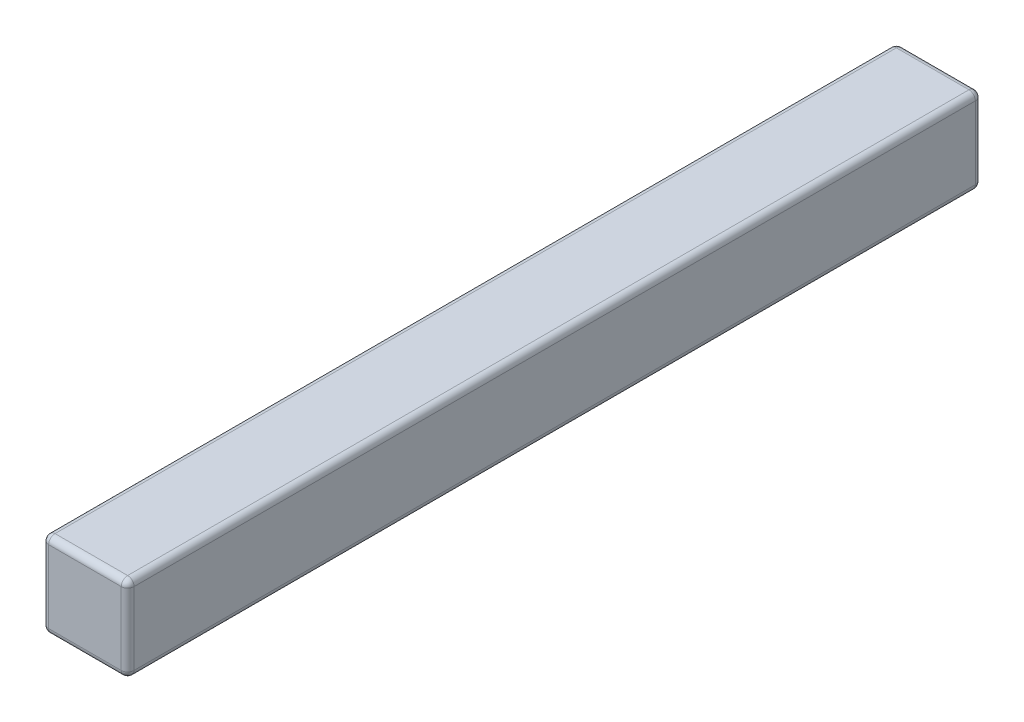
ISO-10303-21;
HEADER;
FILE_DESCRIPTION(('STEP AP214'),'2;1');
FILE_NAME('part.step','',(''),(''),'','','');
FILE_SCHEMA(('AUTOMOTIVE_DESIGN { 1 0 10303 214 1 1 1 1 }'));
ENDSEC;
DATA;
#1=APPLICATION_CONTEXT('core data for automotive mechanical design processes');
#2=APPLICATION_PROTOCOL_DEFINITION('international standard','automotive_design',2000,#1);
#3=PRODUCT_CONTEXT('',#1,'mechanical');
#4=PRODUCT('Part','Part','',(#3));
#5=PRODUCT_RELATED_PRODUCT_CATEGORY('part','',(#4));
#6=PRODUCT_DEFINITION_FORMATION('','',#4);
#7=PRODUCT_DEFINITION_CONTEXT('part definition',#1,'design');
#8=PRODUCT_DEFINITION('design','',#6,#7);
#9=PRODUCT_DEFINITION_SHAPE('','',#8);
#10=(LENGTH_UNIT() NAMED_UNIT(*) SI_UNIT(.MILLI.,.METRE.));
#11=(NAMED_UNIT(*) PLANE_ANGLE_UNIT() SI_UNIT($,.RADIAN.));
#12=(NAMED_UNIT(*) SI_UNIT($,.STERADIAN.) SOLID_ANGLE_UNIT());
#13=UNCERTAINTY_MEASURE_WITH_UNIT(LENGTH_MEASURE(1.E-05),#10,'distance_accuracy_value','');
#14=(GEOMETRIC_REPRESENTATION_CONTEXT(3) GLOBAL_UNCERTAINTY_ASSIGNED_CONTEXT((#13)) GLOBAL_UNIT_ASSIGNED_CONTEXT((#10,
#11,#12)) REPRESENTATION_CONTEXT('',''));
#15=CARTESIAN_POINT('',(0.,0.,0.));
#16=DIRECTION('',(0.,0.,1.));
#17=DIRECTION('',(1.,0.,0.));
#18=AXIS2_PLACEMENT_3D('',#15,#16,#17);
#19=CARTESIAN_POINT('',(1.,-1.,10.));
#20=DIRECTION('',(0.,1.,0.));
#21=DIRECTION('',(-1.,0.,0.));
#22=AXIS2_PLACEMENT_3D('',#19,#20,#21);
#23=PLANE('',#22);
#24=DIRECTION('',(1.,0.,0.));
#25=VECTOR('',#24,1.);
#26=CARTESIAN_POINT('',(1.,-1.,9.85));
#27=LINE('',#26,#25);
#28=CARTESIAN_POINT('',(0.85,-1.,9.85));
#29=VERTEX_POINT('',#28);
#30=CARTESIAN_POINT('',(-0.85,-1.,9.85));
#31=VERTEX_POINT('',#30);
#32=EDGE_CURVE('E131',#29,#31,#27,.F.);
#33=ORIENTED_EDGE('',*,*,#32,.T.);
#34=DIRECTION('',(0.,0.,-1.));
#35=VECTOR('',#34,1.);
#36=CARTESIAN_POINT('',(-0.85,-1.,10.));
#37=LINE('',#36,#35);
#38=CARTESIAN_POINT('',(-0.85,-1.,-9.85));
#39=VERTEX_POINT('',#38);
#40=EDGE_CURVE('E167',#31,#39,#37,.T.);
#41=ORIENTED_EDGE('',*,*,#40,.T.);
#42=DIRECTION('',(1.,0.,0.));
#43=VECTOR('',#42,1.);
#44=CARTESIAN_POINT('',(1.,-1.,-9.85));
#45=LINE('',#44,#43);
#46=CARTESIAN_POINT('',(0.85,-1.,-9.85));
#47=VERTEX_POINT('',#46);
#48=EDGE_CURVE('E134',#39,#47,#45,.T.);
#49=ORIENTED_EDGE('',*,*,#48,.T.);
#50=DIRECTION('',(0.,0.,-1.));
#51=VECTOR('',#50,1.);
#52=CARTESIAN_POINT('',(0.85,-1.,10.));
#53=LINE('',#52,#51);
#54=EDGE_CURVE('E127',#47,#29,#53,.F.);
#55=ORIENTED_EDGE('',*,*,#54,.T.);
#56=EDGE_LOOP('',(#33,#41,#49,#55));
#57=FACE_BOUND('',#56,.T.);
#58=ADVANCED_FACE('F39',(#57),#23,.F.);
#59=CARTESIAN_POINT('',(1.,-1.,10.));
#60=DIRECTION('',(-1.,0.,0.));
#61=DIRECTION('',(0.,0.,1.));
#62=AXIS2_PLACEMENT_3D('',#59,#60,#61);
#63=PLANE('',#62);
#64=DIRECTION('',(0.,1.,0.));
#65=VECTOR('',#64,1.);
#66=CARTESIAN_POINT('',(1.,1.,-9.85));
#67=LINE('',#66,#65);
#68=CARTESIAN_POINT('',(1.,-0.85,-9.85));
#69=VERTEX_POINT('',#68);
#70=CARTESIAN_POINT('',(1.,0.850000000000001,-9.85));
#71=VERTEX_POINT('',#70);
#72=EDGE_CURVE('E199',#69,#71,#67,.T.);
#73=ORIENTED_EDGE('',*,*,#72,.T.);
#74=DIRECTION('',(0.,0.,-1.));
#75=VECTOR('',#74,1.);
#76=CARTESIAN_POINT('',(1.,0.850000000000001,10.));
#77=LINE('',#76,#75);
#78=CARTESIAN_POINT('',(1.,0.850000000000001,9.85));
#79=VERTEX_POINT('',#78);
#80=EDGE_CURVE('E201',#71,#79,#77,.F.);
#81=ORIENTED_EDGE('',*,*,#80,.T.);
#82=DIRECTION('',(0.,1.,0.));
#83=VECTOR('',#82,1.);
#84=CARTESIAN_POINT('',(1.,-1.,9.85));
#85=LINE('',#84,#83);
#86=CARTESIAN_POINT('',(1.,-0.85,9.85));
#87=VERTEX_POINT('',#86);
#88=EDGE_CURVE('E196',#79,#87,#85,.F.);
#89=ORIENTED_EDGE('',*,*,#88,.T.);
#90=DIRECTION('',(0.,0.,-1.));
#91=VECTOR('',#90,1.);
#92=CARTESIAN_POINT('',(1.,-0.85,10.));
#93=LINE('',#92,#91);
#94=EDGE_CURVE('E144',#87,#69,#93,.T.);
#95=ORIENTED_EDGE('',*,*,#94,.T.);
#96=EDGE_LOOP('',(#73,#81,#89,#95));
#97=FACE_BOUND('',#96,.T.);
#98=ADVANCED_FACE('F300',(#97),#63,.F.);
#99=CARTESIAN_POINT('',(1.,1.,10.));
#100=DIRECTION('',(0.,-1.,0.));
#101=DIRECTION('',(1.,0.,0.));
#102=AXIS2_PLACEMENT_3D('',#99,#100,#101);
#103=PLANE('',#102);
#104=DIRECTION('',(-1.,0.,0.));
#105=VECTOR('',#104,1.);
#106=CARTESIAN_POINT('',(-1.,1.,-9.85));
#107=LINE('',#106,#105);
#108=CARTESIAN_POINT('',(0.85,1.,-9.85));
#109=VERTEX_POINT('',#108);
#110=CARTESIAN_POINT('',(-0.850000000000001,1.,-9.85));
#111=VERTEX_POINT('',#110);
#112=EDGE_CURVE('E191',#109,#111,#107,.T.);
#113=ORIENTED_EDGE('',*,*,#112,.T.);
#114=DIRECTION('',(0.,0.,-1.));
#115=VECTOR('',#114,1.);
#116=CARTESIAN_POINT('',(-0.850000000000001,1.,10.));
#117=LINE('',#116,#115);
#118=CARTESIAN_POINT('',(-0.850000000000001,1.,9.85));
#119=VERTEX_POINT('',#118);
#120=EDGE_CURVE('E193',#111,#119,#117,.F.);
#121=ORIENTED_EDGE('',*,*,#120,.T.);
#122=DIRECTION('',(-1.,0.,0.));
#123=VECTOR('',#122,1.);
#124=CARTESIAN_POINT('',(1.,1.,9.85));
#125=LINE('',#124,#123);
#126=CARTESIAN_POINT('',(0.85,1.,9.85));
#127=VERTEX_POINT('',#126);
#128=EDGE_CURVE('E187',#119,#127,#125,.F.);
#129=ORIENTED_EDGE('',*,*,#128,.T.);
#130=DIRECTION('',(0.,0.,-1.));
#131=VECTOR('',#130,1.);
#132=CARTESIAN_POINT('',(0.85,1.,10.));
#133=LINE('',#132,#131);
#134=EDGE_CURVE('E189',#127,#109,#133,.T.);
#135=ORIENTED_EDGE('',*,*,#134,.T.);
#136=EDGE_LOOP('',(#113,#121,#129,#135));
#137=FACE_BOUND('',#136,.T.);
#138=ADVANCED_FACE('F280',(#137),#103,.F.);
#139=CARTESIAN_POINT('',(-1.,-1.,10.));
#140=DIRECTION('',(1.,0.,0.));
#141=DIRECTION('',(0.,1.,0.));
#142=AXIS2_PLACEMENT_3D('',#139,#140,#141);
#143=PLANE('',#142);
#144=DIRECTION('',(0.,-1.,0.));
#145=VECTOR('',#144,1.);
#146=CARTESIAN_POINT('',(-1.,-1.,-9.85));
#147=LINE('',#146,#145);
#148=CARTESIAN_POINT('',(-1.,0.85,-9.85));
#149=VERTEX_POINT('',#148);
#150=CARTESIAN_POINT('',(-1.,-0.85,-9.85));
#151=VERTEX_POINT('',#150);
#152=EDGE_CURVE('E173',#149,#151,#147,.T.);
#153=ORIENTED_EDGE('',*,*,#152,.T.);
#154=DIRECTION('',(0.,0.,-1.));
#155=VECTOR('',#154,1.);
#156=CARTESIAN_POINT('',(-1.,-0.85,10.));
#157=LINE('',#156,#155);
#158=CARTESIAN_POINT('',(-1.,-0.85,9.85));
#159=VERTEX_POINT('',#158);
#160=EDGE_CURVE('E175',#151,#159,#157,.F.);
#161=ORIENTED_EDGE('',*,*,#160,.T.);
#162=DIRECTION('',(0.,-1.,0.));
#163=VECTOR('',#162,1.);
#164=CARTESIAN_POINT('',(-1.,-1.,9.85));
#165=LINE('',#164,#163);
#166=CARTESIAN_POINT('',(-1.,0.85,9.85));
#167=VERTEX_POINT('',#166);
#168=EDGE_CURVE('E169',#159,#167,#165,.F.);
#169=ORIENTED_EDGE('',*,*,#168,.T.);
#170=DIRECTION('',(0.,0.,-1.));
#171=VECTOR('',#170,1.);
#172=CARTESIAN_POINT('',(-1.,0.85,10.));
#173=LINE('',#172,#171);
#174=EDGE_CURVE('E171',#167,#149,#173,.T.);
#175=ORIENTED_EDGE('',*,*,#174,.T.);
#176=EDGE_LOOP('',(#153,#161,#169,#175));
#177=FACE_BOUND('',#176,.T.);
#178=ADVANCED_FACE('F307',(#177),#143,.F.);
#179=CARTESIAN_POINT('',(0.,0.,10.));
#180=DIRECTION('',(0.,0.,-1.));
#181=DIRECTION('',(-1.,0.,0.));
#182=AXIS2_PLACEMENT_3D('',#179,#180,#181);
#183=PLANE('',#182);
#184=DIRECTION('',(-1.,0.,0.));
#185=VECTOR('',#184,1.);
#186=CARTESIAN_POINT('',(0.,0.85,10.));
#187=LINE('',#186,#185);
#188=CARTESIAN_POINT('',(0.85,0.850000000000001,10.));
#189=VERTEX_POINT('',#188);
#190=CARTESIAN_POINT('',(-0.850000000000001,0.85,10.));
#191=VERTEX_POINT('',#190);
#192=EDGE_CURVE('E48',#189,#191,#187,.T.);
#193=ORIENTED_EDGE('',*,*,#192,.T.);
#194=DIRECTION('',(0.,-1.,0.));
#195=VECTOR('',#194,1.);
#196=CARTESIAN_POINT('',(-0.850000000000001,0.,10.));
#197=LINE('',#196,#195);
#198=CARTESIAN_POINT('',(-0.850000000000001,-0.85,10.));
#199=VERTEX_POINT('',#198);
#200=EDGE_CURVE('E11',#191,#199,#197,.T.);
#201=ORIENTED_EDGE('',*,*,#200,.T.);
#202=DIRECTION('',(1.,0.,0.));
#203=VECTOR('',#202,1.);
#204=CARTESIAN_POINT('',(0.,-0.85,10.));
#205=LINE('',#204,#203);
#206=CARTESIAN_POINT('',(0.85,-0.85,10.));
#207=VERTEX_POINT('',#206);
#208=EDGE_CURVE('E204',#199,#207,#205,.T.);
#209=ORIENTED_EDGE('',*,*,#208,.T.);
#210=DIRECTION('',(0.,1.,0.));
#211=VECTOR('',#210,1.);
#212=CARTESIAN_POINT('',(0.85,0.,10.));
#213=LINE('',#212,#211);
#214=EDGE_CURVE('E59',#207,#189,#213,.T.);
#215=ORIENTED_EDGE('',*,*,#214,.T.);
#216=EDGE_LOOP('',(#193,#201,#209,#215));
#217=FACE_BOUND('',#216,.T.);
#218=ADVANCED_FACE('F371',(#217),#183,.F.);
#219=CARTESIAN_POINT('',(0.,0.,-10.));
#220=DIRECTION('',(0.,0.,-1.));
#221=DIRECTION('',(-1.,0.,0.));
#222=AXIS2_PLACEMENT_3D('',#219,#220,#221);
#223=PLANE('',#222);
#224=DIRECTION('',(1.,0.,0.));
#225=VECTOR('',#224,1.);
#226=CARTESIAN_POINT('',(-1.,-0.850000000000001,-10.));
#227=LINE('',#226,#225);
#228=CARTESIAN_POINT('',(0.85,-0.85,-10.));
#229=VERTEX_POINT('',#228);
#230=CARTESIAN_POINT('',(-0.850000000000001,-0.85,-10.));
#231=VERTEX_POINT('',#230);
#232=EDGE_CURVE('E182',#229,#231,#227,.F.);
#233=ORIENTED_EDGE('',*,*,#232,.T.);
#234=DIRECTION('',(0.,-1.,0.));
#235=VECTOR('',#234,1.);
#236=CARTESIAN_POINT('',(-0.850000000000001,1.,-10.));
#237=LINE('',#236,#235);
#238=CARTESIAN_POINT('',(-0.850000000000001,0.85,-10.));
#239=VERTEX_POINT('',#238);
#240=EDGE_CURVE('E184',#231,#239,#237,.F.);
#241=ORIENTED_EDGE('',*,*,#240,.T.);
#242=DIRECTION('',(-1.,0.,0.));
#243=VECTOR('',#242,1.);
#244=CARTESIAN_POINT('',(1.,0.850000000000001,-10.));
#245=LINE('',#244,#243);
#246=CARTESIAN_POINT('',(0.85,0.850000000000001,-10.));
#247=VERTEX_POINT('',#246);
#248=EDGE_CURVE('E180',#239,#247,#245,.F.);
#249=ORIENTED_EDGE('',*,*,#248,.T.);
#250=DIRECTION('',(0.,1.,0.));
#251=VECTOR('',#250,1.);
#252=CARTESIAN_POINT('',(0.85,-1.,-10.));
#253=LINE('',#252,#251);
#254=EDGE_CURVE('E178',#247,#229,#253,.F.);
#255=ORIENTED_EDGE('',*,*,#254,.T.);
#256=EDGE_LOOP('',(#233,#241,#249,#255));
#257=FACE_BOUND('',#256,.T.);
#258=ADVANCED_FACE('F271',(#257),#223,.T.);
#259=CARTESIAN_POINT('',(0.85,0.850000000000001,10.));
#260=DIRECTION('',(0.,0.,-1.));
#261=DIRECTION('',(-1.,0.,0.));
#262=AXIS2_PLACEMENT_3D('',#259,#260,#261);
#263=CYLINDRICAL_SURFACE('',#262,0.15);
#264=CARTESIAN_POINT('',(0.85,0.850000000000001,9.85));
#265=DIRECTION('',(0.,0.,1.));
#266=DIRECTION('',(1.,0.,0.));
#267=AXIS2_PLACEMENT_3D('',#264,#265,#266);
#268=CIRCLE('',#267,0.15);
#269=EDGE_CURVE('E43',#79,#127,#268,.T.);
#270=ORIENTED_EDGE('',*,*,#269,.F.);
#271=ORIENTED_EDGE('',*,*,#80,.F.);
#272=CARTESIAN_POINT('',(0.85,0.850000000000001,-9.85));
#273=DIRECTION('',(0.,0.,-1.));
#274=DIRECTION('',(-1.,0.,0.));
#275=AXIS2_PLACEMENT_3D('',#272,#273,#274);
#276=CIRCLE('',#275,0.15);
#277=EDGE_CURVE('E164',#109,#71,#276,.T.);
#278=ORIENTED_EDGE('',*,*,#277,.F.);
#279=ORIENTED_EDGE('',*,*,#134,.F.);
#280=EDGE_LOOP('',(#270,#271,#278,#279));
#281=FACE_BOUND('',#280,.T.);
#282=ADVANCED_FACE('F41',(#281),#263,.T.);
#283=CARTESIAN_POINT('',(0.85,0.850000000000001,9.85));
#284=DIRECTION('',(0.,0.,1.));
#285=DIRECTION('',(1.,0.,0.));
#286=AXIS2_PLACEMENT_3D('',#283,#284,#285);
#287=SPHERICAL_SURFACE('',#286,0.15);
#288=CARTESIAN_POINT('',(0.85,0.850000000000001,9.85));
#289=DIRECTION('',(0.,1.,0.));
#290=DIRECTION('',(0.,0.,1.));
#291=AXIS2_PLACEMENT_3D('',#288,#289,#290);
#292=CIRCLE('',#291,0.15);
#293=EDGE_CURVE('E250',#79,#189,#292,.F.);
#294=ORIENTED_EDGE('',*,*,#293,.F.);
#295=ORIENTED_EDGE('',*,*,#269,.T.);
#296=CARTESIAN_POINT('',(0.85,0.850000000000001,9.85));
#297=DIRECTION('',(1.,0.,0.));
#298=DIRECTION('',(0.,0.,-1.));
#299=AXIS2_PLACEMENT_3D('',#296,#297,#298);
#300=CIRCLE('',#299,0.15);
#301=EDGE_CURVE('E252',#189,#127,#300,.F.);
#302=ORIENTED_EDGE('',*,*,#301,.F.);
#303=EDGE_LOOP('',(#294,#295,#302));
#304=FACE_BOUND('',#303,.T.);
#305=ADVANCED_FACE('F296',(#304),#287,.T.);
#306=CARTESIAN_POINT('',(0.85,0.850000000000001,-9.85));
#307=DIRECTION('',(0.,0.,1.));
#308=DIRECTION('',(1.,0.,0.));
#309=AXIS2_PLACEMENT_3D('',#306,#307,#308);
#310=SPHERICAL_SURFACE('',#309,0.15);
#311=CARTESIAN_POINT('',(0.85,0.850000000000001,-9.85));
#312=DIRECTION('',(1.,0.,0.));
#313=DIRECTION('',(0.,0.,-1.));
#314=AXIS2_PLACEMENT_3D('',#311,#312,#313);
#315=CIRCLE('',#314,0.15);
#316=EDGE_CURVE('E244',#109,#247,#315,.F.);
#317=ORIENTED_EDGE('',*,*,#316,.F.);
#318=ORIENTED_EDGE('',*,*,#277,.T.);
#319=CARTESIAN_POINT('',(0.85,0.850000000000001,-9.85));
#320=DIRECTION('',(0.,1.,0.));
#321=DIRECTION('',(0.,0.,1.));
#322=AXIS2_PLACEMENT_3D('',#319,#320,#321);
#323=CIRCLE('',#322,0.15);
#324=EDGE_CURVE('E247',#247,#71,#323,.F.);
#325=ORIENTED_EDGE('',*,*,#324,.F.);
#326=EDGE_LOOP('',(#317,#318,#325));
#327=FACE_BOUND('',#326,.T.);
#328=ADVANCED_FACE('F259',(#327),#310,.T.);
#329=CARTESIAN_POINT('',(0.,0.85,9.85));
#330=DIRECTION('',(-1.,0.,0.));
#331=DIRECTION('',(0.,-1.,0.));
#332=AXIS2_PLACEMENT_3D('',#329,#330,#331);
#333=CYLINDRICAL_SURFACE('',#332,0.15);
#334=ORIENTED_EDGE('',*,*,#301,.T.);
#335=ORIENTED_EDGE('',*,*,#128,.F.);
#336=CARTESIAN_POINT('',(-0.850000000000001,0.85,9.85));
#337=DIRECTION('',(-1.,0.,0.));
#338=DIRECTION('',(0.,0.,1.));
#339=AXIS2_PLACEMENT_3D('',#336,#337,#338);
#340=CIRCLE('',#339,0.15);
#341=EDGE_CURVE('E239',#191,#119,#340,.T.);
#342=ORIENTED_EDGE('',*,*,#341,.F.);
#343=ORIENTED_EDGE('',*,*,#192,.F.);
#344=EDGE_LOOP('',(#334,#335,#342,#343));
#345=FACE_BOUND('',#344,.T.);
#346=ADVANCED_FACE('F291',(#345),#333,.T.);
#347=CARTESIAN_POINT('',(0.85,0.,9.85));
#348=DIRECTION('',(0.,1.,0.));
#349=DIRECTION('',(0.,0.,1.));
#350=AXIS2_PLACEMENT_3D('',#347,#348,#349);
#351=CYLINDRICAL_SURFACE('',#350,0.15);
#352=ORIENTED_EDGE('',*,*,#293,.T.);
#353=ORIENTED_EDGE('',*,*,#214,.F.);
#354=CARTESIAN_POINT('',(0.85,-0.85,9.85));
#355=DIRECTION('',(0.,-1.,0.));
#356=DIRECTION('',(0.,0.,-1.));
#357=AXIS2_PLACEMENT_3D('',#354,#355,#356);
#358=CIRCLE('',#357,0.15);
#359=EDGE_CURVE('E148',#87,#207,#358,.T.);
#360=ORIENTED_EDGE('',*,*,#359,.F.);
#361=ORIENTED_EDGE('',*,*,#88,.F.);
#362=EDGE_LOOP('',(#352,#353,#360,#361));
#363=FACE_BOUND('',#362,.T.);
#364=ADVANCED_FACE('F298',(#363),#351,.T.);
#365=CARTESIAN_POINT('',(0.85,-0.85,10.));
#366=DIRECTION('',(0.,0.,-1.));
#367=DIRECTION('',(-1.,0.,0.));
#368=AXIS2_PLACEMENT_3D('',#365,#366,#367);
#369=CYLINDRICAL_SURFACE('',#368,0.15);
#370=CARTESIAN_POINT('',(0.85,-0.85,-9.85));
#371=DIRECTION('',(0.,0.,-1.));
#372=DIRECTION('',(-1.,0.,0.));
#373=AXIS2_PLACEMENT_3D('',#370,#371,#372);
#374=CIRCLE('',#373,0.15);
#375=EDGE_CURVE('E149',#69,#47,#374,.T.);
#376=ORIENTED_EDGE('',*,*,#375,.F.);
#377=ORIENTED_EDGE('',*,*,#94,.F.);
#378=CARTESIAN_POINT('',(0.85,-0.85,9.85));
#379=DIRECTION('',(0.,0.,1.));
#380=DIRECTION('',(1.,0.,0.));
#381=AXIS2_PLACEMENT_3D('',#378,#379,#380);
#382=CIRCLE('',#381,0.15);
#383=EDGE_CURVE('E141',#29,#87,#382,.T.);
#384=ORIENTED_EDGE('',*,*,#383,.F.);
#385=ORIENTED_EDGE('',*,*,#54,.F.);
#386=EDGE_LOOP('',(#376,#377,#384,#385));
#387=FACE_BOUND('',#386,.T.);
#388=ADVANCED_FACE('F143',(#387),#369,.T.);
#389=CARTESIAN_POINT('',(0.85,-1.,-9.85));
#390=DIRECTION('',(0.,-1.,0.));
#391=DIRECTION('',(0.,0.,-1.));
#392=AXIS2_PLACEMENT_3D('',#389,#390,#391);
#393=CYLINDRICAL_SURFACE('',#392,0.15);
#394=ORIENTED_EDGE('',*,*,#324,.T.);
#395=ORIENTED_EDGE('',*,*,#72,.F.);
#396=CARTESIAN_POINT('',(0.85,-0.85,-9.85));
#397=DIRECTION('',(0.,-1.,0.));
#398=DIRECTION('',(1.,0.,0.));
#399=AXIS2_PLACEMENT_3D('',#396,#397,#398);
#400=CIRCLE('',#399,0.15);
#401=EDGE_CURVE('E234',#229,#69,#400,.T.);
#402=ORIENTED_EDGE('',*,*,#401,.F.);
#403=ORIENTED_EDGE('',*,*,#254,.F.);
#404=EDGE_LOOP('',(#394,#395,#402,#403));
#405=FACE_BOUND('',#404,.T.);
#406=ADVANCED_FACE('F267',(#405),#393,.T.);
#407=CARTESIAN_POINT('',(1.,0.850000000000001,-9.85));
#408=DIRECTION('',(1.,0.,0.));
#409=DIRECTION('',(0.,1.,0.));
#410=AXIS2_PLACEMENT_3D('',#407,#408,#409);
#411=CYLINDRICAL_SURFACE('',#410,0.15);
#412=ORIENTED_EDGE('',*,*,#316,.T.);
#413=ORIENTED_EDGE('',*,*,#248,.F.);
#414=CARTESIAN_POINT('',(-0.850000000000001,0.85,-9.85));
#415=DIRECTION('',(-1.,0.,0.));
#416=DIRECTION('',(0.,0.,1.));
#417=AXIS2_PLACEMENT_3D('',#414,#415,#416);
#418=CIRCLE('',#417,0.15);
#419=EDGE_CURVE('E231',#111,#239,#418,.T.);
#420=ORIENTED_EDGE('',*,*,#419,.F.);
#421=ORIENTED_EDGE('',*,*,#112,.F.);
#422=EDGE_LOOP('',(#412,#413,#420,#421));
#423=FACE_BOUND('',#422,.T.);
#424=ADVANCED_FACE('F277',(#423),#411,.T.);
#425=CARTESIAN_POINT('',(-0.850000000000001,0.85,10.));
#426=DIRECTION('',(0.,0.,-1.));
#427=DIRECTION('',(-1.,0.,0.));
#428=AXIS2_PLACEMENT_3D('',#425,#426,#427);
#429=CYLINDRICAL_SURFACE('',#428,0.15);
#430=CARTESIAN_POINT('',(-0.850000000000001,0.85,9.85));
#431=DIRECTION('',(0.,0.,1.));
#432=DIRECTION('',(1.,0.,0.));
#433=AXIS2_PLACEMENT_3D('',#430,#431,#432);
#434=CIRCLE('',#433,0.15);
#435=EDGE_CURVE('E241',#119,#167,#434,.T.);
#436=ORIENTED_EDGE('',*,*,#435,.F.);
#437=ORIENTED_EDGE('',*,*,#120,.F.);
#438=CARTESIAN_POINT('',(-0.850000000000001,0.85,-9.85));
#439=DIRECTION('',(0.,0.,-1.));
#440=DIRECTION('',(-1.,0.,0.));
#441=AXIS2_PLACEMENT_3D('',#438,#439,#440);
#442=CIRCLE('',#441,0.15);
#443=EDGE_CURVE('E228',#149,#111,#442,.T.);
#444=ORIENTED_EDGE('',*,*,#443,.F.);
#445=ORIENTED_EDGE('',*,*,#174,.F.);
#446=EDGE_LOOP('',(#436,#437,#444,#445));
#447=FACE_BOUND('',#446,.T.);
#448=ADVANCED_FACE('F284',(#447),#429,.T.);
#449=CARTESIAN_POINT('',(-0.850000000000001,0.85,9.85));
#450=DIRECTION('',(0.,0.,1.));
#451=DIRECTION('',(1.,0.,0.));
#452=AXIS2_PLACEMENT_3D('',#449,#450,#451);
#453=SPHERICAL_SURFACE('',#452,0.15);
#454=ORIENTED_EDGE('',*,*,#341,.T.);
#455=ORIENTED_EDGE('',*,*,#435,.T.);
#456=CARTESIAN_POINT('',(-0.850000000000001,0.85,9.85));
#457=DIRECTION('',(0.,1.,0.));
#458=DIRECTION('',(0.,0.,1.));
#459=AXIS2_PLACEMENT_3D('',#456,#457,#458);
#460=CIRCLE('',#459,0.15);
#461=EDGE_CURVE('E156',#191,#167,#460,.F.);
#462=ORIENTED_EDGE('',*,*,#461,.F.);
#463=EDGE_LOOP('',(#454,#455,#462));
#464=FACE_BOUND('',#463,.T.);
#465=ADVANCED_FACE('F348',(#464),#453,.T.);
#466=CARTESIAN_POINT('',(0.85,-0.85,9.85));
#467=DIRECTION('',(0.,0.,1.));
#468=DIRECTION('',(1.,0.,0.));
#469=AXIS2_PLACEMENT_3D('',#466,#467,#468);
#470=SPHERICAL_SURFACE('',#469,0.15);
#471=ORIENTED_EDGE('',*,*,#383,.T.);
#472=ORIENTED_EDGE('',*,*,#359,.T.);
#473=CARTESIAN_POINT('',(0.85,-0.85,9.85));
#474=DIRECTION('',(1.,0.,0.));
#475=DIRECTION('',(0.,1.,0.));
#476=AXIS2_PLACEMENT_3D('',#473,#474,#475);
#477=CIRCLE('',#476,0.15);
#478=EDGE_CURVE('E152',#29,#207,#477,.F.);
#479=ORIENTED_EDGE('',*,*,#478,.F.);
#480=EDGE_LOOP('',(#471,#472,#479));
#481=FACE_BOUND('',#480,.T.);
#482=ADVANCED_FACE('F153',(#481),#470,.T.);
#483=CARTESIAN_POINT('',(0.85,-0.85,-9.85));
#484=DIRECTION('',(0.,0.,1.));
#485=DIRECTION('',(1.,0.,0.));
#486=AXIS2_PLACEMENT_3D('',#483,#484,#485);
#487=SPHERICAL_SURFACE('',#486,0.15);
#488=ORIENTED_EDGE('',*,*,#401,.T.);
#489=ORIENTED_EDGE('',*,*,#375,.T.);
#490=CARTESIAN_POINT('',(0.85,-0.85,-9.85));
#491=DIRECTION('',(1.,0.,0.));
#492=DIRECTION('',(0.,1.,0.));
#493=AXIS2_PLACEMENT_3D('',#490,#491,#492);
#494=CIRCLE('',#493,0.15);
#495=EDGE_CURVE('E157',#229,#47,#494,.F.);
#496=ORIENTED_EDGE('',*,*,#495,.F.);
#497=EDGE_LOOP('',(#488,#489,#496));
#498=FACE_BOUND('',#497,.T.);
#499=ADVANCED_FACE('F341',(#498),#487,.T.);
#500=CARTESIAN_POINT('',(-0.850000000000001,0.85,-9.85));
#501=DIRECTION('',(0.,0.,1.));
#502=DIRECTION('',(1.,0.,0.));
#503=AXIS2_PLACEMENT_3D('',#500,#501,#502);
#504=SPHERICAL_SURFACE('',#503,0.15);
#505=ORIENTED_EDGE('',*,*,#443,.T.);
#506=ORIENTED_EDGE('',*,*,#419,.T.);
#507=CARTESIAN_POINT('',(-0.850000000000001,0.85,-9.85));
#508=DIRECTION('',(0.,1.,0.));
#509=DIRECTION('',(0.,0.,1.));
#510=AXIS2_PLACEMENT_3D('',#507,#508,#509);
#511=CIRCLE('',#510,0.15);
#512=EDGE_CURVE('E222',#149,#239,#511,.F.);
#513=ORIENTED_EDGE('',*,*,#512,.F.);
#514=EDGE_LOOP('',(#505,#506,#513));
#515=FACE_BOUND('',#514,.T.);
#516=ADVANCED_FACE('F337',(#515),#504,.T.);
#517=CARTESIAN_POINT('',(-0.850000000000001,0.,9.85));
#518=DIRECTION('',(0.,-1.,0.));
#519=DIRECTION('',(1.,0.,0.));
#520=AXIS2_PLACEMENT_3D('',#517,#518,#519);
#521=CYLINDRICAL_SURFACE('',#520,0.15);
#522=ORIENTED_EDGE('',*,*,#461,.T.);
#523=ORIENTED_EDGE('',*,*,#168,.F.);
#524=CARTESIAN_POINT('',(-0.850000000000001,-0.85,9.85));
#525=DIRECTION('',(0.,-1.,0.));
#526=DIRECTION('',(0.,0.,-1.));
#527=AXIS2_PLACEMENT_3D('',#524,#525,#526);
#528=CIRCLE('',#527,0.15);
#529=EDGE_CURVE('E219',#199,#159,#528,.T.);
#530=ORIENTED_EDGE('',*,*,#529,.F.);
#531=ORIENTED_EDGE('',*,*,#200,.F.);
#532=EDGE_LOOP('',(#522,#523,#530,#531));
#533=FACE_BOUND('',#532,.T.);
#534=ADVANCED_FACE('F334',(#533),#521,.T.);
#535=CARTESIAN_POINT('',(0.,-0.85,9.85));
#536=DIRECTION('',(1.,0.,0.));
#537=DIRECTION('',(0.,1.,0.));
#538=AXIS2_PLACEMENT_3D('',#535,#536,#537);
#539=CYLINDRICAL_SURFACE('',#538,0.15);
#540=ORIENTED_EDGE('',*,*,#478,.T.);
#541=ORIENTED_EDGE('',*,*,#208,.F.);
#542=CARTESIAN_POINT('',(-0.850000000000001,-0.850000000000001,9.85));
#543=DIRECTION('',(-1.,0.,0.));
#544=DIRECTION('',(0.,-1.,0.));
#545=AXIS2_PLACEMENT_3D('',#542,#543,#544);
#546=CIRCLE('',#545,0.15);
#547=EDGE_CURVE('E160',#31,#199,#546,.T.);
#548=ORIENTED_EDGE('',*,*,#547,.F.);
#549=ORIENTED_EDGE('',*,*,#32,.F.);
#550=EDGE_LOOP('',(#540,#541,#548,#549));
#551=FACE_BOUND('',#550,.T.);
#552=ADVANCED_FACE('F159',(#551),#539,.T.);
#553=CARTESIAN_POINT('',(1.,-0.85,-9.85));
#554=DIRECTION('',(-1.,0.,0.));
#555=DIRECTION('',(0.,-1.,0.));
#556=AXIS2_PLACEMENT_3D('',#553,#554,#555);
#557=CYLINDRICAL_SURFACE('',#556,0.15);
#558=ORIENTED_EDGE('',*,*,#495,.T.);
#559=ORIENTED_EDGE('',*,*,#48,.F.);
#560=CARTESIAN_POINT('',(-0.850000000000001,-0.85,-9.85));
#561=DIRECTION('',(-1.,0.,0.));
#562=DIRECTION('',(0.,-1.,0.));
#563=AXIS2_PLACEMENT_3D('',#560,#561,#562);
#564=CIRCLE('',#563,0.15);
#565=EDGE_CURVE('E215',#231,#39,#564,.T.);
#566=ORIENTED_EDGE('',*,*,#565,.F.);
#567=ORIENTED_EDGE('',*,*,#232,.F.);
#568=EDGE_LOOP('',(#558,#559,#566,#567));
#569=FACE_BOUND('',#568,.T.);
#570=ADVANCED_FACE('F327',(#569),#557,.T.);
#571=CARTESIAN_POINT('',(-0.850000000000001,-1.,-9.85));
#572=DIRECTION('',(0.,1.,0.));
#573=DIRECTION('',(-1.,0.,0.));
#574=AXIS2_PLACEMENT_3D('',#571,#572,#573);
#575=CYLINDRICAL_SURFACE('',#574,0.15);
#576=ORIENTED_EDGE('',*,*,#512,.T.);
#577=ORIENTED_EDGE('',*,*,#240,.F.);
#578=CARTESIAN_POINT('',(-0.850000000000001,-0.85,-9.85));
#579=DIRECTION('',(0.,-1.,0.));
#580=DIRECTION('',(0.,0.,-1.));
#581=AXIS2_PLACEMENT_3D('',#578,#579,#580);
#582=CIRCLE('',#581,0.15);
#583=EDGE_CURVE('E212',#151,#231,#582,.T.);
#584=ORIENTED_EDGE('',*,*,#583,.F.);
#585=ORIENTED_EDGE('',*,*,#152,.F.);
#586=EDGE_LOOP('',(#576,#577,#584,#585));
#587=FACE_BOUND('',#586,.T.);
#588=ADVANCED_FACE('F323',(#587),#575,.T.);
#589=CARTESIAN_POINT('',(-0.850000000000001,-0.85,9.85));
#590=DIRECTION('',(0.,0.,1.));
#591=DIRECTION('',(1.,0.,0.));
#592=AXIS2_PLACEMENT_3D('',#589,#590,#591);
#593=SPHERICAL_SURFACE('',#592,0.15);
#594=ORIENTED_EDGE('',*,*,#547,.T.);
#595=ORIENTED_EDGE('',*,*,#529,.T.);
#596=CARTESIAN_POINT('',(-0.850000000000001,-0.85,9.85));
#597=DIRECTION('',(0.,0.,1.));
#598=DIRECTION('',(1.,0.,0.));
#599=AXIS2_PLACEMENT_3D('',#596,#597,#598);
#600=CIRCLE('',#599,0.15);
#601=EDGE_CURVE('E210',#31,#159,#600,.F.);
#602=ORIENTED_EDGE('',*,*,#601,.F.);
#603=EDGE_LOOP('',(#594,#595,#602));
#604=FACE_BOUND('',#603,.T.);
#605=ADVANCED_FACE('F319',(#604),#593,.T.);
#606=CARTESIAN_POINT('',(-0.850000000000001,-0.85,-9.85));
#607=DIRECTION('',(0.,0.,1.));
#608=DIRECTION('',(1.,0.,0.));
#609=AXIS2_PLACEMENT_3D('',#606,#607,#608);
#610=SPHERICAL_SURFACE('',#609,0.15);
#611=ORIENTED_EDGE('',*,*,#583,.T.);
#612=ORIENTED_EDGE('',*,*,#565,.T.);
#613=CARTESIAN_POINT('',(-0.850000000000001,-0.850000000000001,-9.85));
#614=DIRECTION('',(0.,0.,-1.));
#615=DIRECTION('',(-1.,0.,0.));
#616=AXIS2_PLACEMENT_3D('',#613,#614,#615);
#617=CIRCLE('',#616,0.15);
#618=EDGE_CURVE('E208',#151,#39,#617,.F.);
#619=ORIENTED_EDGE('',*,*,#618,.F.);
#620=EDGE_LOOP('',(#611,#612,#619));
#621=FACE_BOUND('',#620,.T.);
#622=ADVANCED_FACE('F315',(#621),#610,.T.);
#623=CARTESIAN_POINT('',(-0.850000000000001,-0.85,10.));
#624=DIRECTION('',(0.,0.,-1.));
#625=DIRECTION('',(-1.,0.,0.));
#626=AXIS2_PLACEMENT_3D('',#623,#624,#625);
#627=CYLINDRICAL_SURFACE('',#626,0.15);
#628=ORIENTED_EDGE('',*,*,#601,.T.);
#629=ORIENTED_EDGE('',*,*,#160,.F.);
#630=ORIENTED_EDGE('',*,*,#618,.T.);
#631=ORIENTED_EDGE('',*,*,#40,.F.);
#632=EDGE_LOOP('',(#628,#629,#630,#631));
#633=FACE_BOUND('',#632,.T.);
#634=ADVANCED_FACE('F312',(#633),#627,.T.);
#635=CLOSED_SHELL('',(#58,#98,#138,#178,#218,#258,#282,#305,#328,#346,#364,#388,#406,#424,#448,
#465,#482,#499,#516,#534,#552,#570,#588,#605,#622,#634));
#636=MANIFOLD_SOLID_BREP('B2',#635);
#637=ADVANCED_BREP_SHAPE_REPRESENTATION('',(#18,#636),#14);
#638=SHAPE_DEFINITION_REPRESENTATION(#9,#637);
ENDSEC;
END-ISO-10303-21;
